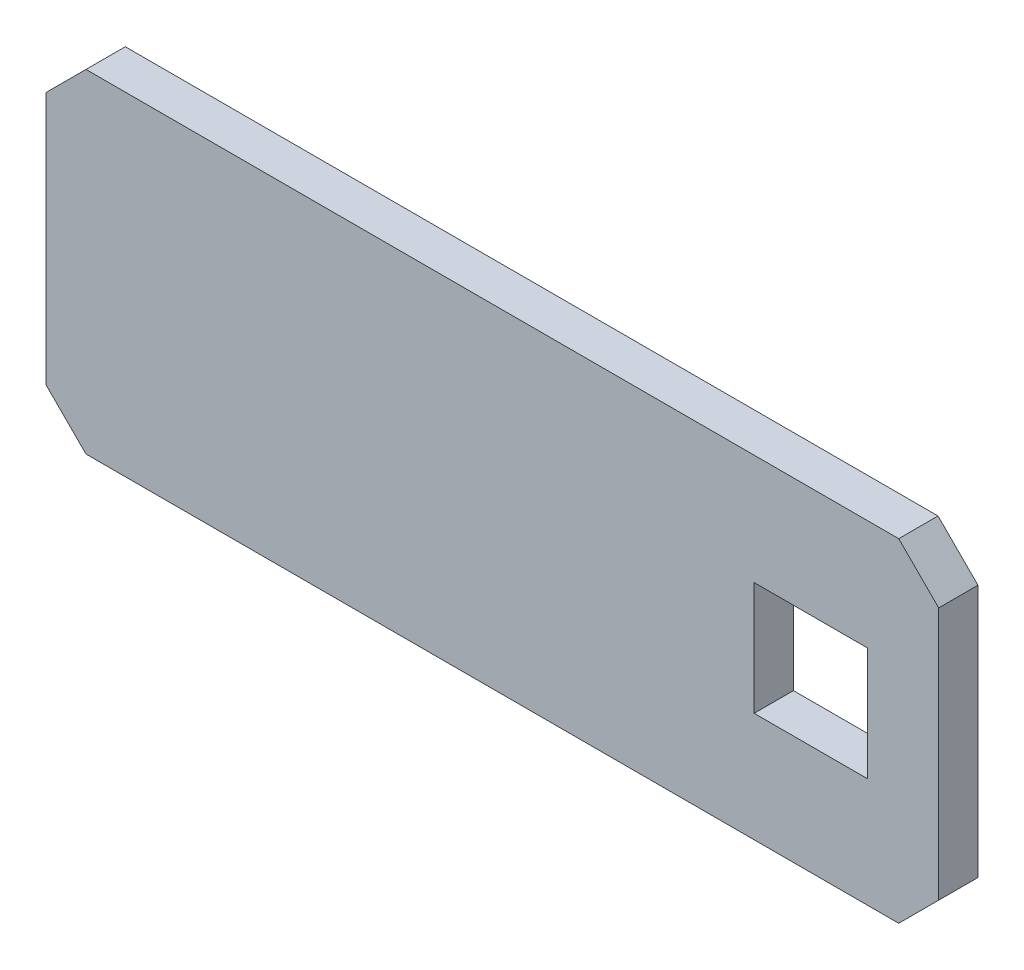
ISO-10303-21;
HEADER;
FILE_DESCRIPTION(('STEP AP214'),'2;1');
FILE_NAME('part.step','',(''),(''),'','','');
FILE_SCHEMA(('AUTOMOTIVE_DESIGN { 1 0 10303 214 1 1 1 1 }'));
ENDSEC;
DATA;
#1=APPLICATION_CONTEXT('core data for automotive mechanical design processes');
#2=APPLICATION_PROTOCOL_DEFINITION('international standard','automotive_design',2000,#1);
#3=PRODUCT_CONTEXT('',#1,'mechanical');
#4=PRODUCT('Part','Part','',(#3));
#5=PRODUCT_RELATED_PRODUCT_CATEGORY('part','',(#4));
#6=PRODUCT_DEFINITION_FORMATION('','',#4);
#7=PRODUCT_DEFINITION_CONTEXT('part definition',#1,'design');
#8=PRODUCT_DEFINITION('design','',#6,#7);
#9=PRODUCT_DEFINITION_SHAPE('','',#8);
#10=(LENGTH_UNIT() NAMED_UNIT(*) SI_UNIT(.MILLI.,.METRE.));
#11=(NAMED_UNIT(*) PLANE_ANGLE_UNIT() SI_UNIT($,.RADIAN.));
#12=(NAMED_UNIT(*) SI_UNIT($,.STERADIAN.) SOLID_ANGLE_UNIT());
#13=UNCERTAINTY_MEASURE_WITH_UNIT(LENGTH_MEASURE(1.E-05),#10,'distance_accuracy_value','');
#14=(GEOMETRIC_REPRESENTATION_CONTEXT(3) GLOBAL_UNCERTAINTY_ASSIGNED_CONTEXT((#13)) GLOBAL_UNIT_ASSIGNED_CONTEXT((#10,
#11,#12)) REPRESENTATION_CONTEXT('',''));
#15=CARTESIAN_POINT('',(0.,0.,0.));
#16=DIRECTION('',(0.,0.,1.));
#17=DIRECTION('',(1.,0.,0.));
#18=AXIS2_PLACEMENT_3D('',#15,#16,#17);
#19=CARTESIAN_POINT('',(-64.3456968628726,31.0161316211878,-2.95));
#20=DIRECTION('',(-1.,0.,0.));
#21=DIRECTION('',(0.,0.,1.));
#22=AXIS2_PLACEMENT_3D('',#19,#20,#21);
#23=PLANE('',#22);
#24=DIRECTION('',(0.,-1.,0.));
#25=VECTOR('',#24,1.);
#26=CARTESIAN_POINT('',(-64.3456968628726,31.0161316211878,-2.95));
#27=LINE('',#26,#25);
#28=CARTESIAN_POINT('',(-64.3456968628726,13.5161316211878,-2.95));
#29=VERTEX_POINT('',#28);
#30=CARTESIAN_POINT('',(-64.3456968628726,-5.48386837881217,-2.95));
#31=VERTEX_POINT('',#30);
#32=EDGE_CURVE('E208',#29,#31,#27,.T.);
#33=ORIENTED_EDGE('',*,*,#32,.T.);
#34=DIRECTION('',(0.,0.,1.));
#35=VECTOR('',#34,1.);
#36=CARTESIAN_POINT('',(-64.3456968628726,-5.48386837881217,0.));
#37=LINE('',#36,#35);
#38=CARTESIAN_POINT('',(-64.3456968628726,-5.48386837881217,0.));
#39=VERTEX_POINT('',#38);
#40=EDGE_CURVE('E12',#31,#39,#37,.T.);
#41=ORIENTED_EDGE('',*,*,#40,.T.);
#42=DIRECTION('',(0.,-1.,0.));
#43=VECTOR('',#42,1.);
#44=CARTESIAN_POINT('',(-64.3456968628726,31.0161316211878,0.));
#45=LINE('',#44,#43);
#46=CARTESIAN_POINT('',(-64.3456968628726,13.5161316211878,0.));
#47=VERTEX_POINT('',#46);
#48=EDGE_CURVE('E207',#47,#39,#45,.T.);
#49=ORIENTED_EDGE('',*,*,#48,.F.);
#50=DIRECTION('',(0.,0.,-1.));
#51=VECTOR('',#50,1.);
#52=CARTESIAN_POINT('',(-64.3456968628726,13.5161316211878,-2.95));
#53=LINE('',#52,#51);
#54=EDGE_CURVE('E82',#47,#29,#53,.T.);
#55=ORIENTED_EDGE('',*,*,#54,.T.);
#56=EDGE_LOOP('',(#33,#41,#49,#55));
#57=FACE_BOUND('',#56,.T.);
#58=ADVANCED_FACE('F74',(#57),#23,.T.);
#59=CARTESIAN_POINT('',(-64.3456968628726,-23.9838683788122,-2.95));
#60=DIRECTION('',(0.,0.,1.));
#61=DIRECTION('',(1.,0.,0.));
#62=AXIS2_PLACEMENT_3D('',#59,#60,#61);
#63=PLANE('',#62);
#64=DIRECTION('',(0.,1.,0.));
#65=VECTOR('',#64,1.);
#66=CARTESIAN_POINT('',(-11.1981666563207,3.51613162118782,-2.95));
#67=LINE('',#66,#65);
#68=CARTESIAN_POINT('',(-11.1981666563207,-0.262009193367798,-2.95));
#69=VERTEX_POINT('',#68);
#70=CARTESIAN_POINT('',(-11.1981666563207,8.2379908066322,-2.95));
#71=VERTEX_POINT('',#70);
#72=EDGE_CURVE('E179',#69,#71,#67,.T.);
#73=ORIENTED_EDGE('',*,*,#72,.F.);
#74=DIRECTION('',(-1.,0.,0.));
#75=VECTOR('',#74,1.);
#76=CARTESIAN_POINT('',(-100.583244883625,-0.262009193367798,-2.95));
#77=LINE('',#76,#75);
#78=CARTESIAN_POINT('',(-2.69816665632074,-0.262009193367798,-2.95));
#79=VERTEX_POINT('',#78);
#80=EDGE_CURVE('E184',#79,#69,#77,.T.);
#81=ORIENTED_EDGE('',*,*,#80,.F.);
#82=DIRECTION('',(0.,1.,0.));
#83=VECTOR('',#82,1.);
#84=CARTESIAN_POINT('',(-2.69816665632074,3.51613162118782,-2.95));
#85=LINE('',#84,#83);
#86=CARTESIAN_POINT('',(-2.69816665632074,8.2379908066322,-2.95));
#87=VERTEX_POINT('',#86);
#88=EDGE_CURVE('E189',#79,#87,#85,.T.);
#89=ORIENTED_EDGE('',*,*,#88,.T.);
#90=DIRECTION('',(-1.,0.,0.));
#91=VECTOR('',#90,1.);
#92=CARTESIAN_POINT('',(-100.583244883625,8.2379908066322,-2.95));
#93=LINE('',#92,#91);
#94=EDGE_CURVE('E168',#87,#71,#93,.T.);
#95=ORIENTED_EDGE('',*,*,#94,.T.);
#96=EDGE_LOOP('',(#73,#81,#89,#95));
#97=FACE_BOUND('',#96,.T.);
#98=DIRECTION('',(1.,0.,0.));
#99=VECTOR('',#98,1.);
#100=CARTESIAN_POINT('',(-100.583244883625,16.5161316211878,-2.95));
#101=LINE('',#100,#99);
#102=CARTESIAN_POINT('',(-61.3456968628726,16.5161316211878,-2.95));
#103=VERTEX_POINT('',#102);
#104=CARTESIAN_POINT('',(-0.345696862872637,16.5161316211878,-2.95));
#105=VERTEX_POINT('',#104);
#106=EDGE_CURVE('E201',#103,#105,#101,.T.);
#107=ORIENTED_EDGE('',*,*,#106,.T.);
#108=DIRECTION('',(-0.707106781186548,0.707106781186547,0.));
#109=VECTOR('',#108,1.);
#110=CARTESIAN_POINT('',(-0.345696862872585,16.5161316211878,-2.95));
#111=LINE('',#110,#109);
#112=CARTESIAN_POINT('',(2.65430313712742,13.5161316211878,-2.95));
#113=VERTEX_POINT('',#112);
#114=EDGE_CURVE('E238',#105,#113,#111,.F.);
#115=ORIENTED_EDGE('',*,*,#114,.T.);
#116=DIRECTION('',(0.,-1.,0.));
#117=VECTOR('',#116,1.);
#118=CARTESIAN_POINT('',(2.65430313712742,3.5161316211878,-2.95));
#119=LINE('',#118,#117);
#120=CARTESIAN_POINT('',(2.65430313712742,-5.48386837881219,-2.95));
#121=VERTEX_POINT('',#120);
#122=EDGE_CURVE('E196',#113,#121,#119,.T.);
#123=ORIENTED_EDGE('',*,*,#122,.T.);
#124=DIRECTION('',(-0.707106781186547,-0.707106781186548,0.));
#125=VECTOR('',#124,1.);
#126=CARTESIAN_POINT('',(2.65430313712742,-5.48386837881219,-2.95));
#127=LINE('',#126,#125);
#128=CARTESIAN_POINT('',(-0.345696862872585,-8.4838683788122,-2.95));
#129=VERTEX_POINT('',#128);
#130=EDGE_CURVE('E236',#121,#129,#127,.T.);
#131=ORIENTED_EDGE('',*,*,#130,.T.);
#132=DIRECTION('',(1.,0.,0.));
#133=VECTOR('',#132,1.);
#134=CARTESIAN_POINT('',(-100.583244883625,-8.48386837881218,-2.95));
#135=LINE('',#134,#133);
#136=CARTESIAN_POINT('',(-61.3456968628726,-8.48386837881219,-2.95));
#137=VERTEX_POINT('',#136);
#138=EDGE_CURVE('E204',#137,#129,#135,.T.);
#139=ORIENTED_EDGE('',*,*,#138,.F.);
#140=DIRECTION('',(-0.707106781186546,0.707106781186549,0.));
#141=VECTOR('',#140,1.);
#142=CARTESIAN_POINT('',(-61.3456968628726,-8.48386837881219,-2.95));
#143=LINE('',#142,#141);
#144=EDGE_CURVE('E234',#137,#31,#143,.T.);
#145=ORIENTED_EDGE('',*,*,#144,.T.);
#146=ORIENTED_EDGE('',*,*,#32,.F.);
#147=DIRECTION('',(-0.707106781186548,-0.707106781186548,0.));
#148=VECTOR('',#147,1.);
#149=CARTESIAN_POINT('',(-64.3456968628726,13.5161316211878,-2.95));
#150=LINE('',#149,#148);
#151=EDGE_CURVE('E232',#29,#103,#150,.F.);
#152=ORIENTED_EDGE('',*,*,#151,.T.);
#153=EDGE_LOOP('',(#107,#115,#123,#131,#139,#145,#146,#152));
#154=FACE_BOUND('',#153,.T.);
#155=ADVANCED_FACE('F186',(#97,#154),#63,.F.);
#156=CARTESIAN_POINT('',(-64.3456968628726,-23.9838683788122,0.));
#157=DIRECTION('',(0.,0.,1.));
#158=DIRECTION('',(1.,0.,0.));
#159=AXIS2_PLACEMENT_3D('',#156,#157,#158);
#160=PLANE('',#159);
#161=DIRECTION('',(1.,0.,0.));
#162=VECTOR('',#161,1.);
#163=CARTESIAN_POINT('',(-64.3456968628726,-0.262009193367798,0.));
#164=LINE('',#163,#162);
#165=CARTESIAN_POINT('',(-11.1981666563207,-0.262009193367798,0.));
#166=VERTEX_POINT('',#165);
#167=CARTESIAN_POINT('',(-2.69816665632074,-0.262009193367798,0.));
#168=VERTEX_POINT('',#167);
#169=EDGE_CURVE('E225',#166,#168,#164,.T.);
#170=ORIENTED_EDGE('',*,*,#169,.F.);
#171=DIRECTION('',(0.,-1.,0.));
#172=VECTOR('',#171,1.);
#173=CARTESIAN_POINT('',(-11.1981666563207,-23.9838683788122,0.));
#174=LINE('',#173,#172);
#175=CARTESIAN_POINT('',(-11.1981666563207,8.2379908066322,0.));
#176=VERTEX_POINT('',#175);
#177=EDGE_CURVE('E219',#176,#166,#174,.T.);
#178=ORIENTED_EDGE('',*,*,#177,.F.);
#179=DIRECTION('',(1.,0.,0.));
#180=VECTOR('',#179,1.);
#181=CARTESIAN_POINT('',(-64.3456968628726,8.2379908066322,0.));
#182=LINE('',#181,#180);
#183=CARTESIAN_POINT('',(-2.69816665632074,8.2379908066322,0.));
#184=VERTEX_POINT('',#183);
#185=EDGE_CURVE('E171',#176,#184,#182,.T.);
#186=ORIENTED_EDGE('',*,*,#185,.T.);
#187=DIRECTION('',(0.,-1.,0.));
#188=VECTOR('',#187,1.);
#189=CARTESIAN_POINT('',(-2.69816665632074,-23.9838683788122,0.));
#190=LINE('',#189,#188);
#191=EDGE_CURVE('E222',#184,#168,#190,.T.);
#192=ORIENTED_EDGE('',*,*,#191,.T.);
#193=EDGE_LOOP('',(#170,#178,#186,#192));
#194=FACE_BOUND('',#193,.T.);
#195=DIRECTION('',(0.,1.,0.));
#196=VECTOR('',#195,1.);
#197=CARTESIAN_POINT('',(2.65430313712742,-23.9838683788122,0.));
#198=LINE('',#197,#196);
#199=CARTESIAN_POINT('',(2.65430313712743,-5.48386837881216,0.));
#200=VERTEX_POINT('',#199);
#201=CARTESIAN_POINT('',(2.65430313712743,13.5161316211878,0.));
#202=VERTEX_POINT('',#201);
#203=EDGE_CURVE('E213',#200,#202,#198,.T.);
#204=ORIENTED_EDGE('',*,*,#203,.T.);
#205=DIRECTION('',(0.707106781186548,-0.707106781186547,0.));
#206=VECTOR('',#205,1.);
#207=CARTESIAN_POINT('',(-12.0956968628726,28.2661316211878,0.));
#208=LINE('',#207,#206);
#209=CARTESIAN_POINT('',(-0.345696862872602,16.5161316211878,0.));
#210=VERTEX_POINT('',#209);
#211=EDGE_CURVE('E250',#202,#210,#208,.F.);
#212=ORIENTED_EDGE('',*,*,#211,.T.);
#213=DIRECTION('',(-1.,0.,0.));
#214=VECTOR('',#213,1.);
#215=CARTESIAN_POINT('',(-64.3456968628726,16.5161316211878,0.));
#216=LINE('',#215,#214);
#217=CARTESIAN_POINT('',(-61.3456968628726,16.5161316211878,0.));
#218=VERTEX_POINT('',#217);
#219=EDGE_CURVE('E210',#210,#218,#216,.T.);
#220=ORIENTED_EDGE('',*,*,#219,.T.);
#221=DIRECTION('',(0.707106781186548,0.707106781186548,0.));
#222=VECTOR('',#221,1.);
#223=CARTESIAN_POINT('',(-83.0956968628726,-5.23386837881219,0.));
#224=LINE('',#223,#222);
#225=EDGE_CURVE('E94',#218,#47,#224,.F.);
#226=ORIENTED_EDGE('',*,*,#225,.T.);
#227=ORIENTED_EDGE('',*,*,#48,.T.);
#228=DIRECTION('',(0.707106781186546,-0.707106781186549,0.));
#229=VECTOR('',#228,1.);
#230=CARTESIAN_POINT('',(-55.0956968628726,-14.7338683788122,0.));
#231=LINE('',#230,#229);
#232=CARTESIAN_POINT('',(-61.3456968628726,-8.48386837881219,0.));
#233=VERTEX_POINT('',#232);
#234=EDGE_CURVE('E246',#39,#233,#231,.T.);
#235=ORIENTED_EDGE('',*,*,#234,.T.);
#236=DIRECTION('',(-1.,0.,0.));
#237=VECTOR('',#236,1.);
#238=CARTESIAN_POINT('',(-64.3456968628726,-8.48386837881219,0.));
#239=LINE('',#238,#237);
#240=CARTESIAN_POINT('',(-0.345696862872596,-8.4838683788122,0.));
#241=VERTEX_POINT('',#240);
#242=EDGE_CURVE('E216',#241,#233,#239,.T.);
#243=ORIENTED_EDGE('',*,*,#242,.F.);
#244=DIRECTION('',(0.707106781186547,0.707106781186548,0.));
#245=VECTOR('',#244,1.);
#246=CARTESIAN_POINT('',(-40.0956968628725,-48.2338683788122,0.));
#247=LINE('',#246,#245);
#248=EDGE_CURVE('E248',#241,#200,#247,.T.);
#249=ORIENTED_EDGE('',*,*,#248,.T.);
#250=EDGE_LOOP('',(#204,#212,#220,#226,#227,#235,#243,#249));
#251=FACE_BOUND('',#250,.T.);
#252=ADVANCED_FACE('F271',(#194,#251),#160,.T.);
#253=CARTESIAN_POINT('',(2.65430313712742,3.5161316211878,7.05));
#254=DIRECTION('',(1.,0.,0.));
#255=DIRECTION('',(0.,1.,0.));
#256=AXIS2_PLACEMENT_3D('',#253,#254,#255);
#257=PLANE('',#256);
#258=ORIENTED_EDGE('',*,*,#122,.F.);
#259=DIRECTION('',(0.,0.,1.));
#260=VECTOR('',#259,1.);
#261=CARTESIAN_POINT('',(2.65430313712742,13.5161316211878,7.05));
#262=LINE('',#261,#260);
#263=EDGE_CURVE('E243',#113,#202,#262,.T.);
#264=ORIENTED_EDGE('',*,*,#263,.T.);
#265=ORIENTED_EDGE('',*,*,#203,.F.);
#266=DIRECTION('',(0.,0.,-1.));
#267=VECTOR('',#266,1.);
#268=CARTESIAN_POINT('',(2.65430313712742,-5.48386837881219,-2.95));
#269=LINE('',#268,#267);
#270=EDGE_CURVE('E240',#200,#121,#269,.T.);
#271=ORIENTED_EDGE('',*,*,#270,.T.);
#272=EDGE_LOOP('',(#258,#264,#265,#271));
#273=FACE_BOUND('',#272,.T.);
#274=ADVANCED_FACE('F278',(#273),#257,.T.);
#275=CARTESIAN_POINT('',(-100.583244883625,-8.48386837881218,7.05));
#276=DIRECTION('',(0.,1.,0.));
#277=DIRECTION('',(-1.,0.,0.));
#278=AXIS2_PLACEMENT_3D('',#275,#276,#277);
#279=PLANE('',#278);
#280=ORIENTED_EDGE('',*,*,#138,.T.);
#281=DIRECTION('',(0.,0.,1.));
#282=VECTOR('',#281,1.);
#283=CARTESIAN_POINT('',(-0.345696862872585,-8.4838683788122,0.));
#284=LINE('',#283,#282);
#285=EDGE_CURVE('E255',#129,#241,#284,.T.);
#286=ORIENTED_EDGE('',*,*,#285,.T.);
#287=ORIENTED_EDGE('',*,*,#242,.T.);
#288=DIRECTION('',(0.,0.,-1.));
#289=VECTOR('',#288,1.);
#290=CARTESIAN_POINT('',(-61.3456968628726,-8.48386837881219,-2.95));
#291=LINE('',#290,#289);
#292=EDGE_CURVE('E252',#233,#137,#291,.T.);
#293=ORIENTED_EDGE('',*,*,#292,.T.);
#294=EDGE_LOOP('',(#280,#286,#287,#293));
#295=FACE_BOUND('',#294,.T.);
#296=ADVANCED_FACE('F267',(#295),#279,.F.);
#297=CARTESIAN_POINT('',(-100.583244883625,16.5161316211878,7.05));
#298=DIRECTION('',(0.,1.,0.));
#299=DIRECTION('',(-1.,0.,0.));
#300=AXIS2_PLACEMENT_3D('',#297,#298,#299);
#301=PLANE('',#300);
#302=ORIENTED_EDGE('',*,*,#219,.F.);
#303=DIRECTION('',(0.,0.,-1.));
#304=VECTOR('',#303,1.);
#305=CARTESIAN_POINT('',(-0.345696862872585,16.5161316211878,7.05));
#306=LINE('',#305,#304);
#307=EDGE_CURVE('E229',#210,#105,#306,.T.);
#308=ORIENTED_EDGE('',*,*,#307,.T.);
#309=ORIENTED_EDGE('',*,*,#106,.F.);
#310=DIRECTION('',(0.,0.,1.));
#311=VECTOR('',#310,1.);
#312=CARTESIAN_POINT('',(-61.3456968628726,16.5161316211878,7.05));
#313=LINE('',#312,#311);
#314=EDGE_CURVE('E227',#103,#218,#313,.T.);
#315=ORIENTED_EDGE('',*,*,#314,.T.);
#316=EDGE_LOOP('',(#302,#308,#309,#315));
#317=FACE_BOUND('',#316,.T.);
#318=ADVANCED_FACE('F286',(#317),#301,.T.);
#319=CARTESIAN_POINT('',(-100.583244883625,-0.262009193367798,7.05));
#320=DIRECTION('',(0.,-1.,0.));
#321=DIRECTION('',(0.,0.,-1.));
#322=AXIS2_PLACEMENT_3D('',#319,#320,#321);
#323=PLANE('',#322);
#324=ORIENTED_EDGE('',*,*,#169,.T.);
#325=DIRECTION('',(0.,0.,-1.));
#326=VECTOR('',#325,1.);
#327=CARTESIAN_POINT('',(-2.69816665632074,-0.262009193367798,7.05));
#328=LINE('',#327,#326);
#329=EDGE_CURVE('E194',#168,#79,#328,.T.);
#330=ORIENTED_EDGE('',*,*,#329,.T.);
#331=ORIENTED_EDGE('',*,*,#80,.T.);
#332=DIRECTION('',(0.,0.,-1.));
#333=VECTOR('',#332,1.);
#334=CARTESIAN_POINT('',(-11.1981666563207,-0.262009193367798,7.05));
#335=LINE('',#334,#333);
#336=EDGE_CURVE('E175',#166,#69,#335,.T.);
#337=ORIENTED_EDGE('',*,*,#336,.F.);
#338=EDGE_LOOP('',(#324,#330,#331,#337));
#339=FACE_BOUND('',#338,.T.);
#340=ADVANCED_FACE('F352',(#339),#323,.F.);
#341=CARTESIAN_POINT('',(-2.69816665632074,3.51613162118782,7.05));
#342=DIRECTION('',(-1.,0.,0.));
#343=DIRECTION('',(0.,0.,1.));
#344=AXIS2_PLACEMENT_3D('',#341,#342,#343);
#345=PLANE('',#344);
#346=DIRECTION('',(0.,0.,-1.));
#347=VECTOR('',#346,1.);
#348=CARTESIAN_POINT('',(-2.69816665632074,8.2379908066322,7.05));
#349=LINE('',#348,#347);
#350=EDGE_CURVE('E174',#184,#87,#349,.T.);
#351=ORIENTED_EDGE('',*,*,#350,.T.);
#352=ORIENTED_EDGE('',*,*,#88,.F.);
#353=ORIENTED_EDGE('',*,*,#329,.F.);
#354=ORIENTED_EDGE('',*,*,#191,.F.);
#355=EDGE_LOOP('',(#351,#352,#353,#354));
#356=FACE_BOUND('',#355,.T.);
#357=ADVANCED_FACE('F342',(#356),#345,.T.);
#358=CARTESIAN_POINT('',(-100.583244883625,8.2379908066322,7.05));
#359=DIRECTION('',(0.,-1.,0.));
#360=DIRECTION('',(0.,0.,-1.));
#361=AXIS2_PLACEMENT_3D('',#358,#359,#360);
#362=PLANE('',#361);
#363=DIRECTION('',(0.,0.,-1.));
#364=VECTOR('',#363,1.);
#365=CARTESIAN_POINT('',(-11.1981666563207,8.2379908066322,7.05));
#366=LINE('',#365,#364);
#367=EDGE_CURVE('E163',#176,#71,#366,.T.);
#368=ORIENTED_EDGE('',*,*,#367,.T.);
#369=ORIENTED_EDGE('',*,*,#94,.F.);
#370=ORIENTED_EDGE('',*,*,#350,.F.);
#371=ORIENTED_EDGE('',*,*,#185,.F.);
#372=EDGE_LOOP('',(#368,#369,#370,#371));
#373=FACE_BOUND('',#372,.T.);
#374=ADVANCED_FACE('F165',(#373),#362,.T.);
#375=CARTESIAN_POINT('',(-11.1981666563207,3.51613162118782,7.05));
#376=DIRECTION('',(-1.,0.,0.));
#377=DIRECTION('',(0.,0.,1.));
#378=AXIS2_PLACEMENT_3D('',#375,#376,#377);
#379=PLANE('',#378);
#380=ORIENTED_EDGE('',*,*,#177,.T.);
#381=ORIENTED_EDGE('',*,*,#336,.T.);
#382=ORIENTED_EDGE('',*,*,#72,.T.);
#383=ORIENTED_EDGE('',*,*,#367,.F.);
#384=EDGE_LOOP('',(#380,#381,#382,#383));
#385=FACE_BOUND('',#384,.T.);
#386=ADVANCED_FACE('F180',(#385),#379,.F.);
#387=CARTESIAN_POINT('',(-0.345696862872585,16.5161316211878,7.05));
#388=DIRECTION('',(-0.707106781186547,-0.707106781186548,0.));
#389=DIRECTION('',(0.707106781186548,-0.707106781186547,0.));
#390=AXIS2_PLACEMENT_3D('',#387,#388,#389);
#391=PLANE('',#390);
#392=ORIENTED_EDGE('',*,*,#211,.F.);
#393=ORIENTED_EDGE('',*,*,#263,.F.);
#394=ORIENTED_EDGE('',*,*,#114,.F.);
#395=ORIENTED_EDGE('',*,*,#307,.F.);
#396=EDGE_LOOP('',(#392,#393,#394,#395));
#397=FACE_BOUND('',#396,.T.);
#398=ADVANCED_FACE('F283',(#397),#391,.F.);
#399=CARTESIAN_POINT('',(2.65430313712742,-5.48386837881219,7.05));
#400=DIRECTION('',(0.707106781186548,-0.707106781186547,0.));
#401=DIRECTION('',(0.707106781186547,0.707106781186548,0.));
#402=AXIS2_PLACEMENT_3D('',#399,#400,#401);
#403=PLANE('',#402);
#404=ORIENTED_EDGE('',*,*,#248,.F.);
#405=ORIENTED_EDGE('',*,*,#285,.F.);
#406=ORIENTED_EDGE('',*,*,#130,.F.);
#407=ORIENTED_EDGE('',*,*,#270,.F.);
#408=EDGE_LOOP('',(#404,#405,#406,#407));
#409=FACE_BOUND('',#408,.T.);
#410=ADVANCED_FACE('F275',(#409),#403,.T.);
#411=CARTESIAN_POINT('',(-61.3456968628726,-8.48386837881219,7.05));
#412=DIRECTION('',(-0.707106781186549,-0.707106781186546,0.));
#413=DIRECTION('',(0.707106781186546,-0.707106781186549,0.));
#414=AXIS2_PLACEMENT_3D('',#411,#412,#413);
#415=PLANE('',#414);
#416=ORIENTED_EDGE('',*,*,#234,.F.);
#417=ORIENTED_EDGE('',*,*,#40,.F.);
#418=ORIENTED_EDGE('',*,*,#144,.F.);
#419=ORIENTED_EDGE('',*,*,#292,.F.);
#420=EDGE_LOOP('',(#416,#417,#418,#419));
#421=FACE_BOUND('',#420,.T.);
#422=ADVANCED_FACE('F265',(#421),#415,.T.);
#423=CARTESIAN_POINT('',(-64.3456968628726,13.5161316211878,-2.95));
#424=DIRECTION('',(0.707106781186547,-0.707106781186547,0.));
#425=DIRECTION('',(0.707106781186548,0.707106781186548,0.));
#426=AXIS2_PLACEMENT_3D('',#423,#424,#425);
#427=PLANE('',#426);
#428=ORIENTED_EDGE('',*,*,#225,.F.);
#429=ORIENTED_EDGE('',*,*,#314,.F.);
#430=ORIENTED_EDGE('',*,*,#151,.F.);
#431=ORIENTED_EDGE('',*,*,#54,.F.);
#432=EDGE_LOOP('',(#428,#429,#430,#431));
#433=FACE_BOUND('',#432,.T.);
#434=ADVANCED_FACE('F76',(#433),#427,.F.);
#435=CLOSED_SHELL('',(#58,#155,#252,#274,#296,#318,#340,#357,#374,#386,#398,#410,#422,#434));
#436=MANIFOLD_SOLID_BREP('B2',#435);
#437=ADVANCED_BREP_SHAPE_REPRESENTATION('',(#18,#436),#14);
#438=SHAPE_DEFINITION_REPRESENTATION(#9,#437);
ENDSEC;
END-ISO-10303-21;
